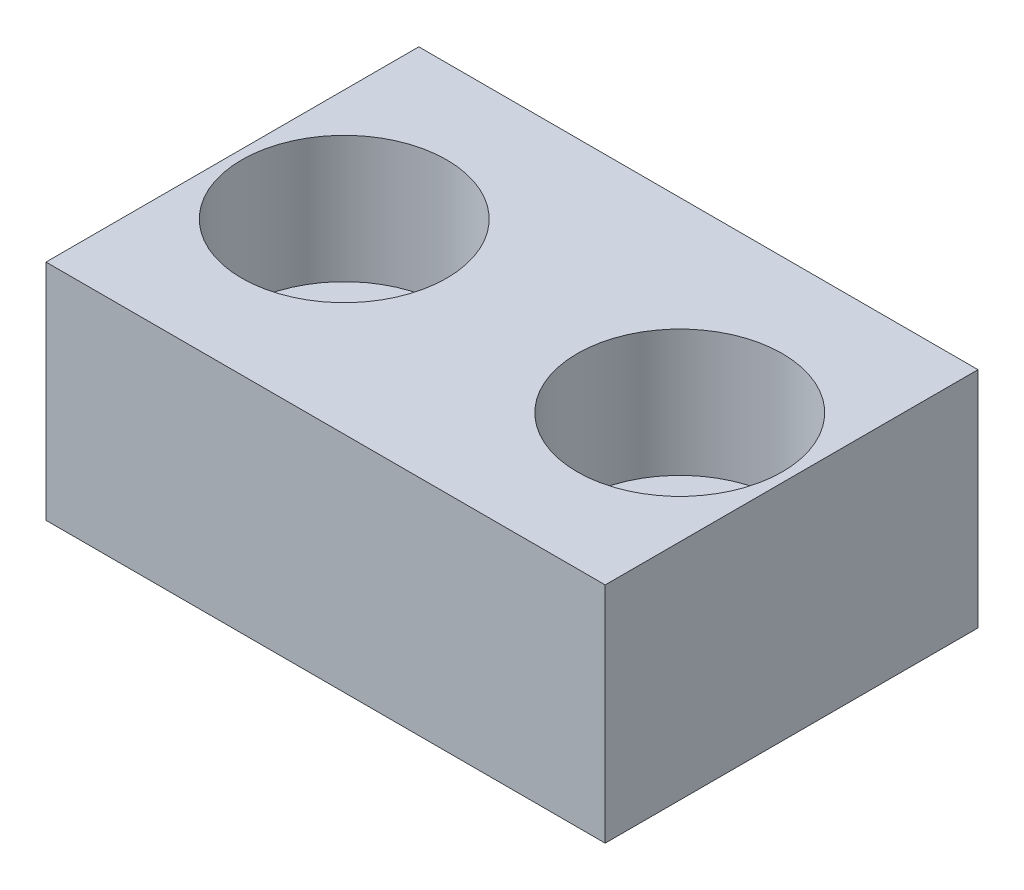
ISO-10303-21;
HEADER;
FILE_DESCRIPTION(('STEP AP214'),'2;1');
FILE_NAME('part.step','',(''),(''),'','','');
FILE_SCHEMA(('AUTOMOTIVE_DESIGN { 1 0 10303 214 1 1 1 1 }'));
ENDSEC;
DATA;
#1=APPLICATION_CONTEXT('core data for automotive mechanical design processes');
#2=APPLICATION_PROTOCOL_DEFINITION('international standard','automotive_design',2000,#1);
#3=PRODUCT_CONTEXT('',#1,'mechanical');
#4=PRODUCT('Part','Part','',(#3));
#5=PRODUCT_RELATED_PRODUCT_CATEGORY('part','',(#4));
#6=PRODUCT_DEFINITION_FORMATION('','',#4);
#7=PRODUCT_DEFINITION_CONTEXT('part definition',#1,'design');
#8=PRODUCT_DEFINITION('design','',#6,#7);
#9=PRODUCT_DEFINITION_SHAPE('','',#8);
#10=(LENGTH_UNIT() NAMED_UNIT(*) SI_UNIT(.MILLI.,.METRE.));
#11=(NAMED_UNIT(*) PLANE_ANGLE_UNIT() SI_UNIT($,.RADIAN.));
#12=(NAMED_UNIT(*) SI_UNIT($,.STERADIAN.) SOLID_ANGLE_UNIT());
#13=UNCERTAINTY_MEASURE_WITH_UNIT(LENGTH_MEASURE(1.E-05),#10,'distance_accuracy_value','');
#14=(GEOMETRIC_REPRESENTATION_CONTEXT(3) GLOBAL_UNCERTAINTY_ASSIGNED_CONTEXT((#13)) GLOBAL_UNIT_ASSIGNED_CONTEXT((#10,
#11,#12)) REPRESENTATION_CONTEXT('',''));
#15=CARTESIAN_POINT('',(0.,0.,0.));
#16=DIRECTION('',(0.,0.,1.));
#17=DIRECTION('',(1.,0.,0.));
#18=AXIS2_PLACEMENT_3D('',#15,#16,#17);
#19=CARTESIAN_POINT('',(15.,12.,10.));
#20=DIRECTION('',(-1.,0.,0.));
#21=DIRECTION('',(0.,0.,1.));
#22=AXIS2_PLACEMENT_3D('',#19,#20,#21);
#23=PLANE('',#22);
#24=DIRECTION('',(0.,0.,-1.));
#25=VECTOR('',#24,1.);
#26=CARTESIAN_POINT('',(15.,0.,10.));
#27=LINE('',#26,#25);
#28=CARTESIAN_POINT('',(15.,0.,10.));
#29=VERTEX_POINT('',#28);
#30=CARTESIAN_POINT('',(15.,0.,-10.));
#31=VERTEX_POINT('',#30);
#32=EDGE_CURVE('E80',#29,#31,#27,.T.);
#33=ORIENTED_EDGE('',*,*,#32,.T.);
#34=DIRECTION('',(0.,-1.,0.));
#35=VECTOR('',#34,1.);
#36=CARTESIAN_POINT('',(15.,12.,-10.));
#37=LINE('',#36,#35);
#38=CARTESIAN_POINT('',(15.,12.,-10.));
#39=VERTEX_POINT('',#38);
#40=EDGE_CURVE('E11',#39,#31,#37,.T.);
#41=ORIENTED_EDGE('',*,*,#40,.F.);
#42=DIRECTION('',(0.,0.,-1.));
#43=VECTOR('',#42,1.);
#44=CARTESIAN_POINT('',(15.,12.,10.));
#45=LINE('',#44,#43);
#46=CARTESIAN_POINT('',(15.,12.,10.));
#47=VERTEX_POINT('',#46);
#48=EDGE_CURVE('E68',#47,#39,#45,.T.);
#49=ORIENTED_EDGE('',*,*,#48,.F.);
#50=DIRECTION('',(0.,-1.,0.));
#51=VECTOR('',#50,1.);
#52=CARTESIAN_POINT('',(15.,12.,10.));
#53=LINE('',#52,#51);
#54=EDGE_CURVE('E76',#47,#29,#53,.T.);
#55=ORIENTED_EDGE('',*,*,#54,.T.);
#56=EDGE_LOOP('',(#33,#41,#49,#55));
#57=FACE_BOUND('',#56,.T.);
#58=ADVANCED_FACE('F17',(#57),#23,.F.);
#59=CARTESIAN_POINT('',(-15.,12.,-10.));
#60=DIRECTION('',(0.,0.,1.));
#61=DIRECTION('',(1.,0.,0.));
#62=AXIS2_PLACEMENT_3D('',#59,#60,#61);
#63=PLANE('',#62);
#64=DIRECTION('',(-1.,0.,0.));
#65=VECTOR('',#64,1.);
#66=CARTESIAN_POINT('',(-15.,0.,-10.));
#67=LINE('',#66,#65);
#68=CARTESIAN_POINT('',(-15.,0.,-10.));
#69=VERTEX_POINT('',#68);
#70=EDGE_CURVE('E72',#31,#69,#67,.T.);
#71=ORIENTED_EDGE('',*,*,#70,.T.);
#72=DIRECTION('',(0.,-1.,0.));
#73=VECTOR('',#72,1.);
#74=CARTESIAN_POINT('',(-15.,12.,-10.));
#75=LINE('',#74,#73);
#76=CARTESIAN_POINT('',(-15.,12.,-10.));
#77=VERTEX_POINT('',#76);
#78=EDGE_CURVE('E25',#77,#69,#75,.T.);
#79=ORIENTED_EDGE('',*,*,#78,.F.);
#80=DIRECTION('',(-1.,0.,0.));
#81=VECTOR('',#80,1.);
#82=CARTESIAN_POINT('',(-15.,12.,-10.));
#83=LINE('',#82,#81);
#84=EDGE_CURVE('E63',#39,#77,#83,.T.);
#85=ORIENTED_EDGE('',*,*,#84,.F.);
#86=ORIENTED_EDGE('',*,*,#40,.T.);
#87=EDGE_LOOP('',(#71,#79,#85,#86));
#88=FACE_BOUND('',#87,.T.);
#89=ADVANCED_FACE('F71',(#88),#63,.F.);
#90=CARTESIAN_POINT('',(-15.,12.,10.));
#91=DIRECTION('',(1.,0.,0.));
#92=DIRECTION('',(0.,0.,-1.));
#93=AXIS2_PLACEMENT_3D('',#90,#91,#92);
#94=PLANE('',#93);
#95=DIRECTION('',(0.,0.,1.));
#96=VECTOR('',#95,1.);
#97=CARTESIAN_POINT('',(-15.,0.,10.));
#98=LINE('',#97,#96);
#99=CARTESIAN_POINT('',(-15.,0.,10.));
#100=VERTEX_POINT('',#99);
#101=EDGE_CURVE('E50',#69,#100,#98,.T.);
#102=ORIENTED_EDGE('',*,*,#101,.T.);
#103=DIRECTION('',(0.,-1.,0.));
#104=VECTOR('',#103,1.);
#105=CARTESIAN_POINT('',(-15.,12.,10.));
#106=LINE('',#105,#104);
#107=CARTESIAN_POINT('',(-15.,12.,10.));
#108=VERTEX_POINT('',#107);
#109=EDGE_CURVE('E73',#108,#100,#106,.T.);
#110=ORIENTED_EDGE('',*,*,#109,.F.);
#111=DIRECTION('',(0.,0.,1.));
#112=VECTOR('',#111,1.);
#113=CARTESIAN_POINT('',(-15.,12.,10.));
#114=LINE('',#113,#112);
#115=EDGE_CURVE('E66',#77,#108,#114,.T.);
#116=ORIENTED_EDGE('',*,*,#115,.F.);
#117=ORIENTED_EDGE('',*,*,#78,.T.);
#118=EDGE_LOOP('',(#102,#110,#116,#117));
#119=FACE_BOUND('',#118,.T.);
#120=ADVANCED_FACE('F74',(#119),#94,.F.);
#121=CARTESIAN_POINT('',(-15.,12.,10.));
#122=DIRECTION('',(0.,0.,-1.));
#123=DIRECTION('',(-1.,0.,0.));
#124=AXIS2_PLACEMENT_3D('',#121,#122,#123);
#125=PLANE('',#124);
#126=DIRECTION('',(1.,0.,0.));
#127=VECTOR('',#126,1.);
#128=CARTESIAN_POINT('',(-15.,0.,10.));
#129=LINE('',#128,#127);
#130=EDGE_CURVE('E56',#100,#29,#129,.T.);
#131=ORIENTED_EDGE('',*,*,#130,.T.);
#132=ORIENTED_EDGE('',*,*,#54,.F.);
#133=DIRECTION('',(1.,0.,0.));
#134=VECTOR('',#133,1.);
#135=CARTESIAN_POINT('',(-15.,12.,10.));
#136=LINE('',#135,#134);
#137=EDGE_CURVE('E33',#108,#47,#136,.T.);
#138=ORIENTED_EDGE('',*,*,#137,.F.);
#139=ORIENTED_EDGE('',*,*,#109,.T.);
#140=EDGE_LOOP('',(#131,#132,#138,#139));
#141=FACE_BOUND('',#140,.T.);
#142=ADVANCED_FACE('F88',(#141),#125,.F.);
#143=CARTESIAN_POINT('',(0.,12.,0.));
#144=DIRECTION('',(0.,-1.,0.));
#145=DIRECTION('',(0.,0.,-1.));
#146=AXIS2_PLACEMENT_3D('',#143,#144,#145);
#147=PLANE('',#146);
#148=CARTESIAN_POINT('',(-9.,12.,0.));
#149=DIRECTION('',(0.,1.,0.));
#150=DIRECTION('',(0.,0.,1.));
#151=AXIS2_PLACEMENT_3D('',#148,#149,#150);
#152=CIRCLE('',#151,5.5);
#153=CARTESIAN_POINT('',(-9.,12.,5.5));
#154=VERTEX_POINT('',#153);
#155=EDGE_CURVE('E114',#154,#154,#152,.T.);
#156=ORIENTED_EDGE('',*,*,#155,.F.);
#157=EDGE_LOOP('',(#156));
#158=FACE_BOUND('',#157,.T.);
#159=CARTESIAN_POINT('',(9.,12.,0.));
#160=DIRECTION('',(0.,1.,0.));
#161=DIRECTION('',(0.,0.,1.));
#162=AXIS2_PLACEMENT_3D('',#159,#160,#161);
#163=CIRCLE('',#162,5.5);
#164=CARTESIAN_POINT('',(9.,12.,5.5));
#165=VERTEX_POINT('',#164);
#166=EDGE_CURVE('E102',#165,#165,#163,.T.);
#167=ORIENTED_EDGE('',*,*,#166,.F.);
#168=EDGE_LOOP('',(#167));
#169=FACE_BOUND('',#168,.T.);
#170=ORIENTED_EDGE('',*,*,#48,.T.);
#171=ORIENTED_EDGE('',*,*,#84,.T.);
#172=ORIENTED_EDGE('',*,*,#115,.T.);
#173=ORIENTED_EDGE('',*,*,#137,.T.);
#174=EDGE_LOOP('',(#170,#171,#172,#173));
#175=FACE_BOUND('',#174,.T.);
#176=ADVANCED_FACE('F64',(#158,#169,#175),#147,.F.);
#177=CARTESIAN_POINT('',(0.,0.,0.));
#178=DIRECTION('',(0.,-1.,0.));
#179=DIRECTION('',(0.,0.,-1.));
#180=AXIS2_PLACEMENT_3D('',#177,#178,#179);
#181=PLANE('',#180);
#182=CARTESIAN_POINT('',(-9.,0.,0.));
#183=DIRECTION('',(0.,1.,0.));
#184=DIRECTION('',(0.,0.,1.));
#185=AXIS2_PLACEMENT_3D('',#182,#183,#184);
#186=CIRCLE('',#185,3.3);
#187=CARTESIAN_POINT('',(-9.,0.,3.3));
#188=VERTEX_POINT('',#187);
#189=EDGE_CURVE('E105',#188,#188,#186,.T.);
#190=ORIENTED_EDGE('',*,*,#189,.T.);
#191=EDGE_LOOP('',(#190));
#192=FACE_BOUND('',#191,.T.);
#193=CARTESIAN_POINT('',(9.,0.,0.));
#194=DIRECTION('',(0.,1.,0.));
#195=DIRECTION('',(0.,0.,1.));
#196=AXIS2_PLACEMENT_3D('',#193,#194,#195);
#197=CIRCLE('',#196,3.3);
#198=CARTESIAN_POINT('',(9.,0.,3.3));
#199=VERTEX_POINT('',#198);
#200=EDGE_CURVE('E83',#199,#199,#197,.T.);
#201=ORIENTED_EDGE('',*,*,#200,.T.);
#202=EDGE_LOOP('',(#201));
#203=FACE_BOUND('',#202,.T.);
#204=ORIENTED_EDGE('',*,*,#32,.F.);
#205=ORIENTED_EDGE('',*,*,#130,.F.);
#206=ORIENTED_EDGE('',*,*,#101,.F.);
#207=ORIENTED_EDGE('',*,*,#70,.F.);
#208=EDGE_LOOP('',(#204,#205,#206,#207));
#209=FACE_BOUND('',#208,.T.);
#210=ADVANCED_FACE('F91',(#192,#203,#209),#181,.T.);
#211=CARTESIAN_POINT('',(9.,12.,0.));
#212=DIRECTION('',(0.,1.,0.));
#213=DIRECTION('',(0.,0.,1.));
#214=AXIS2_PLACEMENT_3D('',#211,#212,#213);
#215=CYLINDRICAL_SURFACE('',#214,3.3);
#216=ORIENTED_EDGE('',*,*,#200,.F.);
#217=EDGE_LOOP('',(#216));
#218=FACE_BOUND('',#217,.T.);
#219=CARTESIAN_POINT('',(9.,5.2,0.));
#220=DIRECTION('',(0.,1.,0.));
#221=DIRECTION('',(0.,0.,1.));
#222=AXIS2_PLACEMENT_3D('',#219,#220,#221);
#223=CIRCLE('',#222,3.3);
#224=CARTESIAN_POINT('',(9.,5.2,3.3));
#225=VERTEX_POINT('',#224);
#226=EDGE_CURVE('E96',#225,#225,#223,.T.);
#227=ORIENTED_EDGE('',*,*,#226,.T.);
#228=EDGE_LOOP('',(#227));
#229=FACE_BOUND('',#228,.T.);
#230=ADVANCED_FACE('F139',(#218,#229),#215,.F.);
#231=CARTESIAN_POINT('',(12.3,5.2,0.));
#232=DIRECTION('',(0.,-1.,0.));
#233=DIRECTION('',(0.,0.,-1.));
#234=AXIS2_PLACEMENT_3D('',#231,#232,#233);
#235=PLANE('',#234);
#236=ORIENTED_EDGE('',*,*,#226,.F.);
#237=EDGE_LOOP('',(#236));
#238=FACE_BOUND('',#237,.T.);
#239=CARTESIAN_POINT('',(9.,5.2,0.));
#240=DIRECTION('',(0.,1.,0.));
#241=DIRECTION('',(0.,0.,1.));
#242=AXIS2_PLACEMENT_3D('',#239,#240,#241);
#243=CIRCLE('',#242,5.5);
#244=CARTESIAN_POINT('',(9.,5.2,5.5));
#245=VERTEX_POINT('',#244);
#246=EDGE_CURVE('E99',#245,#245,#243,.T.);
#247=ORIENTED_EDGE('',*,*,#246,.T.);
#248=EDGE_LOOP('',(#247));
#249=FACE_BOUND('',#248,.T.);
#250=ADVANCED_FACE('F128',(#238,#249),#235,.F.);
#251=CARTESIAN_POINT('',(9.,12.,0.));
#252=DIRECTION('',(0.,1.,0.));
#253=DIRECTION('',(0.,0.,1.));
#254=AXIS2_PLACEMENT_3D('',#251,#252,#253);
#255=CYLINDRICAL_SURFACE('',#254,5.5);
#256=ORIENTED_EDGE('',*,*,#246,.F.);
#257=EDGE_LOOP('',(#256));
#258=FACE_BOUND('',#257,.T.);
#259=ORIENTED_EDGE('',*,*,#166,.T.);
#260=EDGE_LOOP('',(#259));
#261=FACE_BOUND('',#260,.T.);
#262=ADVANCED_FACE('F125',(#258,#261),#255,.F.);
#263=CARTESIAN_POINT('',(-9.,12.,0.));
#264=DIRECTION('',(0.,1.,0.));
#265=DIRECTION('',(0.,0.,1.));
#266=AXIS2_PLACEMENT_3D('',#263,#264,#265);
#267=CYLINDRICAL_SURFACE('',#266,3.3);
#268=ORIENTED_EDGE('',*,*,#189,.F.);
#269=EDGE_LOOP('',(#268));
#270=FACE_BOUND('',#269,.T.);
#271=CARTESIAN_POINT('',(-9.,5.2,0.));
#272=DIRECTION('',(0.,1.,0.));
#273=DIRECTION('',(0.,0.,1.));
#274=AXIS2_PLACEMENT_3D('',#271,#272,#273);
#275=CIRCLE('',#274,3.3);
#276=CARTESIAN_POINT('',(-9.,5.2,3.3));
#277=VERTEX_POINT('',#276);
#278=EDGE_CURVE('E108',#277,#277,#275,.T.);
#279=ORIENTED_EDGE('',*,*,#278,.T.);
#280=EDGE_LOOP('',(#279));
#281=FACE_BOUND('',#280,.T.);
#282=ADVANCED_FACE('F127',(#270,#281),#267,.F.);
#283=CARTESIAN_POINT('',(-5.7,5.2,0.));
#284=DIRECTION('',(0.,-1.,0.));
#285=DIRECTION('',(0.,0.,-1.));
#286=AXIS2_PLACEMENT_3D('',#283,#284,#285);
#287=PLANE('',#286);
#288=ORIENTED_EDGE('',*,*,#278,.F.);
#289=EDGE_LOOP('',(#288));
#290=FACE_BOUND('',#289,.T.);
#291=CARTESIAN_POINT('',(-9.,5.2,0.));
#292=DIRECTION('',(0.,1.,0.));
#293=DIRECTION('',(0.,0.,1.));
#294=AXIS2_PLACEMENT_3D('',#291,#292,#293);
#295=CIRCLE('',#294,5.5);
#296=CARTESIAN_POINT('',(-9.,5.2,5.5));
#297=VERTEX_POINT('',#296);
#298=EDGE_CURVE('E111',#297,#297,#295,.T.);
#299=ORIENTED_EDGE('',*,*,#298,.T.);
#300=EDGE_LOOP('',(#299));
#301=FACE_BOUND('',#300,.T.);
#302=ADVANCED_FACE('F136',(#290,#301),#287,.F.);
#303=CARTESIAN_POINT('',(-9.,12.,0.));
#304=DIRECTION('',(0.,1.,0.));
#305=DIRECTION('',(0.,0.,1.));
#306=AXIS2_PLACEMENT_3D('',#303,#304,#305);
#307=CYLINDRICAL_SURFACE('',#306,5.5);
#308=ORIENTED_EDGE('',*,*,#298,.F.);
#309=EDGE_LOOP('',(#308));
#310=FACE_BOUND('',#309,.T.);
#311=ORIENTED_EDGE('',*,*,#155,.T.);
#312=EDGE_LOOP('',(#311));
#313=FACE_BOUND('',#312,.T.);
#314=ADVANCED_FACE('F118',(#310,#313),#307,.F.);
#315=CLOSED_SHELL('',(#58,#89,#120,#142,#176,#210,#230,#250,#262,#282,#302,#314));
#316=MANIFOLD_SOLID_BREP('B1',#315);
#317=ADVANCED_BREP_SHAPE_REPRESENTATION('',(#18,#316),#14);
#318=SHAPE_DEFINITION_REPRESENTATION(#9,#317);
ENDSEC;
END-ISO-10303-21;
